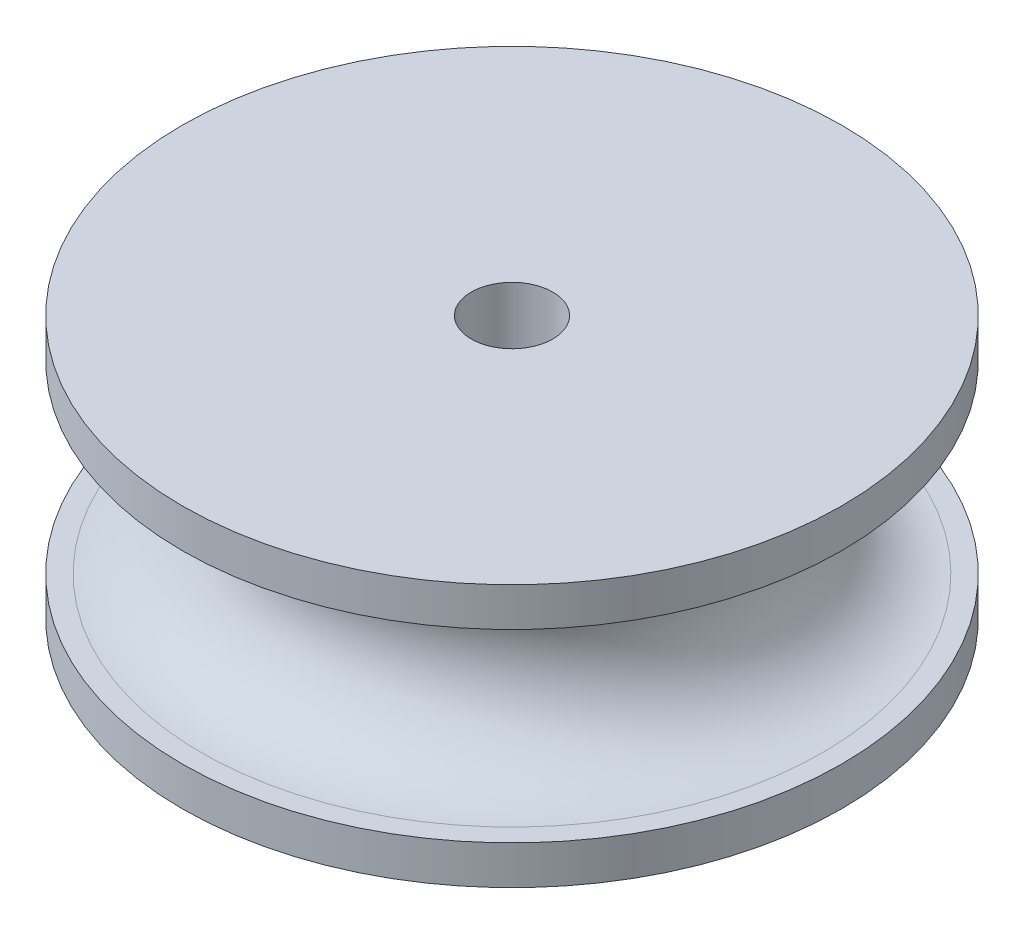
ISO-10303-21;
HEADER;
FILE_DESCRIPTION(('STEP AP214'),'2;1');
FILE_NAME('part.step','',(''),(''),'','','');
FILE_SCHEMA(('AUTOMOTIVE_DESIGN { 1 0 10303 214 1 1 1 1 }'));
ENDSEC;
DATA;
#1=APPLICATION_CONTEXT('core data for automotive mechanical design processes');
#2=APPLICATION_PROTOCOL_DEFINITION('international standard','automotive_design',2000,#1);
#3=PRODUCT_CONTEXT('',#1,'mechanical');
#4=PRODUCT('Part','Part','',(#3));
#5=PRODUCT_RELATED_PRODUCT_CATEGORY('part','',(#4));
#6=PRODUCT_DEFINITION_FORMATION('','',#4);
#7=PRODUCT_DEFINITION_CONTEXT('part definition',#1,'design');
#8=PRODUCT_DEFINITION('design','',#6,#7);
#9=PRODUCT_DEFINITION_SHAPE('','',#8);
#10=(LENGTH_UNIT() NAMED_UNIT(*) SI_UNIT(.MILLI.,.METRE.));
#11=(NAMED_UNIT(*) PLANE_ANGLE_UNIT() SI_UNIT($,.RADIAN.));
#12=(NAMED_UNIT(*) SI_UNIT($,.STERADIAN.) SOLID_ANGLE_UNIT());
#13=UNCERTAINTY_MEASURE_WITH_UNIT(LENGTH_MEASURE(1.E-05),#10,'distance_accuracy_value','');
#14=(GEOMETRIC_REPRESENTATION_CONTEXT(3) GLOBAL_UNCERTAINTY_ASSIGNED_CONTEXT((#13)) GLOBAL_UNIT_ASSIGNED_CONTEXT((#10,
#11,#12)) REPRESENTATION_CONTEXT('',''));
#15=CARTESIAN_POINT('',(0.,0.,0.));
#16=DIRECTION('',(0.,0.,1.));
#17=DIRECTION('',(1.,0.,0.));
#18=AXIS2_PLACEMENT_3D('',#15,#16,#17);
#19=CARTESIAN_POINT('',(-8.5,0.,0.));
#20=DIRECTION('',(0.,1.,0.));
#21=DIRECTION('',(0.,0.,1.));
#22=AXIS2_PLACEMENT_3D('',#19,#20,#21);
#23=PLANE('',#22);
#24=CARTESIAN_POINT('',(0.,0.,0.));
#25=DIRECTION('',(0.,-1.,0.));
#26=DIRECTION('',(0.,0.,-1.));
#27=AXIS2_PLACEMENT_3D('',#24,#25,#26);
#28=CIRCLE('',#27,1.05);
#29=CARTESIAN_POINT('',(0.,0.,-1.05));
#30=VERTEX_POINT('',#29);
#31=EDGE_CURVE('E59',#30,#30,#28,.T.);
#32=ORIENTED_EDGE('',*,*,#31,.F.);
#33=EDGE_LOOP('',(#32));
#34=FACE_BOUND('',#33,.T.);
#35=CARTESIAN_POINT('',(0.,0.,0.));
#36=DIRECTION('',(0.,-1.,0.));
#37=DIRECTION('',(0.,0.,-1.));
#38=AXIS2_PLACEMENT_3D('',#35,#36,#37);
#39=CIRCLE('',#38,8.5);
#40=CARTESIAN_POINT('',(0.,0.,-8.5));
#41=VERTEX_POINT('',#40);
#42=EDGE_CURVE('E10',#41,#41,#39,.T.);
#43=ORIENTED_EDGE('',*,*,#42,.T.);
#44=EDGE_LOOP('',(#43));
#45=FACE_BOUND('',#44,.T.);
#46=ADVANCED_FACE('F31',(#34,#45),#23,.F.);
#47=CARTESIAN_POINT('',(0.,0.,0.));
#48=DIRECTION('',(0.,-1.,0.));
#49=DIRECTION('',(0.,0.,-1.));
#50=AXIS2_PLACEMENT_3D('',#47,#48,#49);
#51=CYLINDRICAL_SURFACE('',#50,8.5);
#52=ORIENTED_EDGE('',*,*,#42,.F.);
#53=EDGE_LOOP('',(#52));
#54=FACE_BOUND('',#53,.T.);
#55=CARTESIAN_POINT('',(0.,1.,0.));
#56=DIRECTION('',(0.,-1.,0.));
#57=DIRECTION('',(0.,0.,-1.));
#58=AXIS2_PLACEMENT_3D('',#55,#56,#57);
#59=CIRCLE('',#58,8.5);
#60=CARTESIAN_POINT('',(0.,1.,-8.5));
#61=VERTEX_POINT('',#60);
#62=EDGE_CURVE('E37',#61,#61,#59,.T.);
#63=ORIENTED_EDGE('',*,*,#62,.T.);
#64=EDGE_LOOP('',(#63));
#65=FACE_BOUND('',#64,.T.);
#66=ADVANCED_FACE('F66',(#54,#65),#51,.T.);
#67=CARTESIAN_POINT('',(-8.,1.,0.));
#68=DIRECTION('',(0.,-1.,0.));
#69=DIRECTION('',(0.,0.,-1.));
#70=AXIS2_PLACEMENT_3D('',#67,#68,#69);
#71=PLANE('',#70);
#72=ORIENTED_EDGE('',*,*,#62,.F.);
#73=EDGE_LOOP('',(#72));
#74=FACE_BOUND('',#73,.T.);
#75=CARTESIAN_POINT('',(0.,1.,0.));
#76=DIRECTION('',(0.,-1.,0.));
#77=DIRECTION('',(0.,0.,-1.));
#78=AXIS2_PLACEMENT_3D('',#75,#76,#77);
#79=CIRCLE('',#78,8.);
#80=CARTESIAN_POINT('',(0.,1.,-8.));
#81=VERTEX_POINT('',#80);
#82=EDGE_CURVE('E41',#81,#81,#79,.T.);
#83=ORIENTED_EDGE('',*,*,#82,.T.);
#84=EDGE_LOOP('',(#83));
#85=FACE_BOUND('',#84,.T.);
#86=ADVANCED_FACE('F70',(#74,#85),#71,.F.);
#87=CARTESIAN_POINT('',(0.,3.38125,0.));
#88=DIRECTION('',(0.,-1.,0.));
#89=DIRECTION('',(0.,0.,-1.));
#90=AXIS2_PLACEMENT_3D('',#87,#88,#89);
#91=TOROIDAL_SURFACE('',#90,8.,2.38125);
#92=ORIENTED_EDGE('',*,*,#82,.F.);
#93=EDGE_LOOP('',(#92));
#94=FACE_BOUND('',#93,.T.);
#95=CARTESIAN_POINT('',(0.,5.7625,0.));
#96=DIRECTION('',(0.,-1.,0.));
#97=DIRECTION('',(0.,0.,-1.));
#98=AXIS2_PLACEMENT_3D('',#95,#96,#97);
#99=CIRCLE('',#98,8.);
#100=CARTESIAN_POINT('',(0.,5.7625,-8.));
#101=VERTEX_POINT('',#100);
#102=EDGE_CURVE('E45',#101,#101,#99,.T.);
#103=ORIENTED_EDGE('',*,*,#102,.T.);
#104=EDGE_LOOP('',(#103));
#105=FACE_BOUND('',#104,.T.);
#106=ADVANCED_FACE('F75',(#94,#105),#91,.F.);
#107=CARTESIAN_POINT('',(-8.5,5.7625,0.));
#108=DIRECTION('',(0.,1.,0.));
#109=DIRECTION('',(0.,0.,1.));
#110=AXIS2_PLACEMENT_3D('',#107,#108,#109);
#111=PLANE('',#110);
#112=ORIENTED_EDGE('',*,*,#102,.F.);
#113=EDGE_LOOP('',(#112));
#114=FACE_BOUND('',#113,.T.);
#115=CARTESIAN_POINT('',(0.,5.7625,0.));
#116=DIRECTION('',(0.,-1.,0.));
#117=DIRECTION('',(0.,0.,-1.));
#118=AXIS2_PLACEMENT_3D('',#115,#116,#117);
#119=CIRCLE('',#118,8.5);
#120=CARTESIAN_POINT('',(0.,5.7625,-8.5));
#121=VERTEX_POINT('',#120);
#122=EDGE_CURVE('E50',#121,#121,#119,.T.);
#123=ORIENTED_EDGE('',*,*,#122,.T.);
#124=EDGE_LOOP('',(#123));
#125=FACE_BOUND('',#124,.T.);
#126=ADVANCED_FACE('F81',(#114,#125),#111,.F.);
#127=CARTESIAN_POINT('',(0.,0.,0.));
#128=DIRECTION('',(0.,-1.,0.));
#129=DIRECTION('',(0.,0.,-1.));
#130=AXIS2_PLACEMENT_3D('',#127,#128,#129);
#131=CYLINDRICAL_SURFACE('',#130,8.5);
#132=ORIENTED_EDGE('',*,*,#122,.F.);
#133=EDGE_LOOP('',(#132));
#134=FACE_BOUND('',#133,.T.);
#135=CARTESIAN_POINT('',(0.,6.7625,0.));
#136=DIRECTION('',(0.,-1.,0.));
#137=DIRECTION('',(0.,0.,-1.));
#138=AXIS2_PLACEMENT_3D('',#135,#136,#137);
#139=CIRCLE('',#138,8.5);
#140=CARTESIAN_POINT('',(0.,6.7625,-8.5));
#141=VERTEX_POINT('',#140);
#142=EDGE_CURVE('E53',#141,#141,#139,.T.);
#143=ORIENTED_EDGE('',*,*,#142,.T.);
#144=EDGE_LOOP('',(#143));
#145=FACE_BOUND('',#144,.T.);
#146=ADVANCED_FACE('F85',(#134,#145),#131,.T.);
#147=CARTESIAN_POINT('',(-1.05,6.7625,0.));
#148=DIRECTION('',(0.,-1.,0.));
#149=DIRECTION('',(0.,0.,-1.));
#150=AXIS2_PLACEMENT_3D('',#147,#148,#149);
#151=PLANE('',#150);
#152=ORIENTED_EDGE('',*,*,#142,.F.);
#153=EDGE_LOOP('',(#152));
#154=FACE_BOUND('',#153,.T.);
#155=CARTESIAN_POINT('',(0.,6.7625,0.));
#156=DIRECTION('',(0.,-1.,0.));
#157=DIRECTION('',(0.,0.,-1.));
#158=AXIS2_PLACEMENT_3D('',#155,#156,#157);
#159=CIRCLE('',#158,1.05);
#160=CARTESIAN_POINT('',(0.,6.7625,-1.05));
#161=VERTEX_POINT('',#160);
#162=EDGE_CURVE('E56',#161,#161,#159,.T.);
#163=ORIENTED_EDGE('',*,*,#162,.T.);
#164=EDGE_LOOP('',(#163));
#165=FACE_BOUND('',#164,.T.);
#166=ADVANCED_FACE('F89',(#154,#165),#151,.F.);
#167=CARTESIAN_POINT('',(0.,0.,0.));
#168=DIRECTION('',(0.,-1.,0.));
#169=DIRECTION('',(0.,0.,-1.));
#170=AXIS2_PLACEMENT_3D('',#167,#168,#169);
#171=CYLINDRICAL_SURFACE('',#170,1.05);
#172=ORIENTED_EDGE('',*,*,#162,.F.);
#173=EDGE_LOOP('',(#172));
#174=FACE_BOUND('',#173,.T.);
#175=ORIENTED_EDGE('',*,*,#31,.T.);
#176=EDGE_LOOP('',(#175));
#177=FACE_BOUND('',#176,.T.);
#178=ADVANCED_FACE('F63',(#174,#177),#171,.F.);
#179=CLOSED_SHELL('',(#46,#66,#86,#106,#126,#146,#166,#178));
#180=MANIFOLD_SOLID_BREP('B2',#179);
#181=ADVANCED_BREP_SHAPE_REPRESENTATION('',(#18,#180),#14);
#182=SHAPE_DEFINITION_REPRESENTATION(#9,#181);
ENDSEC;
END-ISO-10303-21;
